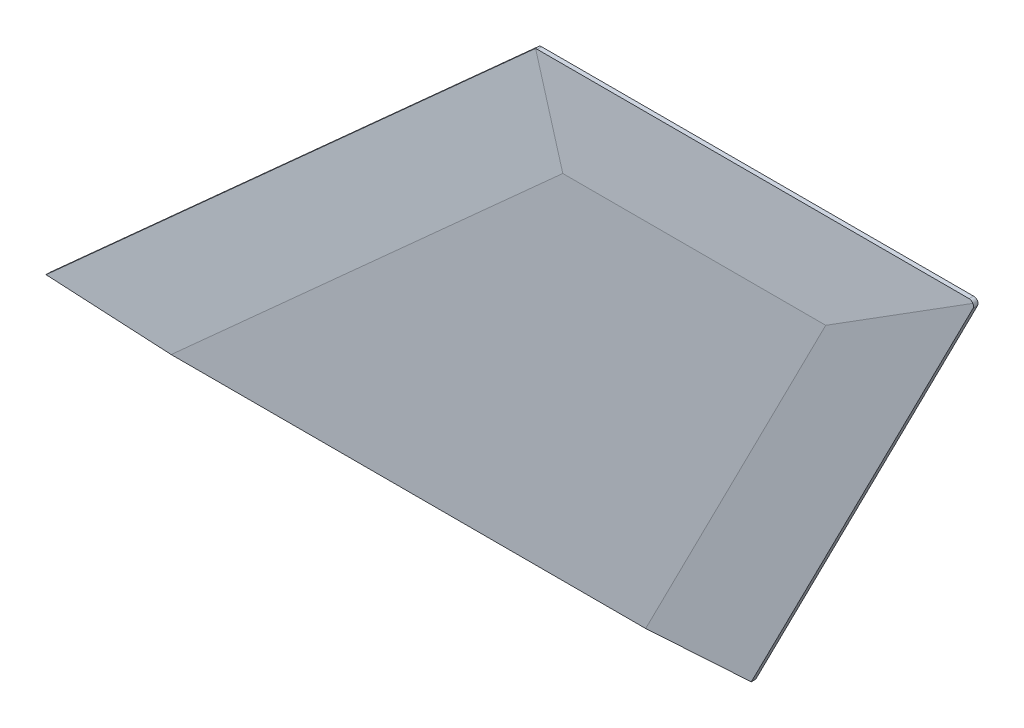
ISO-10303-21;
HEADER;
FILE_DESCRIPTION(('STEP AP214'),'2;1');
FILE_NAME('part.step','',(''),(''),'','','');
FILE_SCHEMA(('AUTOMOTIVE_DESIGN { 1 0 10303 214 1 1 1 1 }'));
ENDSEC;
DATA;
#1=APPLICATION_CONTEXT('core data for automotive mechanical design processes');
#2=APPLICATION_PROTOCOL_DEFINITION('international standard','automotive_design',2000,#1);
#3=PRODUCT_CONTEXT('',#1,'mechanical');
#4=PRODUCT('Part','Part','',(#3));
#5=PRODUCT_RELATED_PRODUCT_CATEGORY('part','',(#4));
#6=PRODUCT_DEFINITION_FORMATION('','',#4);
#7=PRODUCT_DEFINITION_CONTEXT('part definition',#1,'design');
#8=PRODUCT_DEFINITION('design','',#6,#7);
#9=PRODUCT_DEFINITION_SHAPE('','',#8);
#10=(LENGTH_UNIT() NAMED_UNIT(*) SI_UNIT(.MILLI.,.METRE.));
#11=(NAMED_UNIT(*) PLANE_ANGLE_UNIT() SI_UNIT($,.RADIAN.));
#12=(NAMED_UNIT(*) SI_UNIT($,.STERADIAN.) SOLID_ANGLE_UNIT());
#13=UNCERTAINTY_MEASURE_WITH_UNIT(LENGTH_MEASURE(1.E-05),#10,'distance_accuracy_value','');
#14=(GEOMETRIC_REPRESENTATION_CONTEXT(3) GLOBAL_UNCERTAINTY_ASSIGNED_CONTEXT((#13)) GLOBAL_UNIT_ASSIGNED_CONTEXT((#10,
#11,#12)) REPRESENTATION_CONTEXT('',''));
#15=CARTESIAN_POINT('',(0.,0.,0.));
#16=DIRECTION('',(0.,0.,1.));
#17=DIRECTION('',(1.,0.,0.));
#18=AXIS2_PLACEMENT_3D('',#15,#16,#17);
#19=CARTESIAN_POINT('',(55.5306257414602,50.,1.));
#20=DIRECTION('',(0.669130606358854,-0.743144825477398,0.));
#21=DIRECTION('',(0.743144825477398,0.669130606358854,0.));
#22=AXIS2_PLACEMENT_3D('',#19,#20,#21);
#23=PLANE('',#22);
#24=DIRECTION('',(0.743144825477398,0.669130606358854,0.));
#25=VECTOR('',#24,1.);
#26=CARTESIAN_POINT('',(55.5306257414602,50.,0.249999999999999));
#27=LINE('',#26,#25);
#28=CARTESIAN_POINT('',(0.,0.,0.249999999999999));
#29=VERTEX_POINT('',#28);
#30=CARTESIAN_POINT('',(55.3879924557985,49.8715724127387,0.249999999999999));
#31=VERTEX_POINT('',#30);
#32=EDGE_CURVE('E184',#29,#31,#27,.T.);
#33=ORIENTED_EDGE('',*,*,#32,.T.);
#34=DIRECTION('',(0.,0.,-1.));
#35=VECTOR('',#34,1.);
#36=CARTESIAN_POINT('',(55.3879924557985,49.8715724127387,1.));
#37=LINE('',#36,#35);
#38=CARTESIAN_POINT('',(55.3879924557985,49.8715724127387,-0.249999999999999));
#39=VERTEX_POINT('',#38);
#40=EDGE_CURVE('E153',#31,#39,#37,.T.);
#41=ORIENTED_EDGE('',*,*,#40,.T.);
#42=DIRECTION('',(0.743144825477398,0.669130606358854,0.));
#43=VECTOR('',#42,1.);
#44=CARTESIAN_POINT('',(55.5306257414602,50.,-0.249999999999999));
#45=LINE('',#44,#43);
#46=CARTESIAN_POINT('',(0.,0.,-0.249999999999999));
#47=VERTEX_POINT('',#46);
#48=EDGE_CURVE('E139',#47,#39,#45,.T.);
#49=ORIENTED_EDGE('',*,*,#48,.F.);
#50=DIRECTION('',(0.,0.,-1.));
#51=VECTOR('',#50,1.);
#52=CARTESIAN_POINT('',(0.,0.,1.));
#53=LINE('',#52,#51);
#54=EDGE_CURVE('E152',#29,#47,#53,.T.);
#55=ORIENTED_EDGE('',*,*,#54,.F.);
#56=EDGE_LOOP('',(#33,#41,#49,#55));
#57=FACE_BOUND('',#56,.T.);
#58=ADVANCED_FACE('F46',(#57),#23,.F.);
#59=CARTESIAN_POINT('',(0.,0.,1.));
#60=DIRECTION('',(0.,1.,0.));
#61=DIRECTION('',(0.,0.,1.));
#62=AXIS2_PLACEMENT_3D('',#59,#60,#61);
#63=PLANE('',#62);
#64=DIRECTION('',(-0.997776578470076,0.,-0.066647576524195));
#65=VECTOR('',#64,1.);
#66=CARTESIAN_POINT('',(54.61257312416,0.,-1.94578091124806));
#67=LINE('',#66,#65);
#68=CARTESIAN_POINT('',(80.,0.,-0.249999999999999));
#69=VERTEX_POINT('',#68);
#70=CARTESIAN_POINT('',(68.7717982726515,0.,-1.));
#71=VERTEX_POINT('',#70);
#72=EDGE_CURVE('E266',#69,#71,#67,.T.);
#73=ORIENTED_EDGE('',*,*,#72,.F.);
#74=DIRECTION('',(0.,0.,-1.));
#75=VECTOR('',#74,1.);
#76=CARTESIAN_POINT('',(80.,0.,1.));
#77=LINE('',#76,#75);
#78=CARTESIAN_POINT('',(80.,0.,0.249999999999999));
#79=VERTEX_POINT('',#78);
#80=EDGE_CURVE('E162',#79,#69,#77,.T.);
#81=ORIENTED_EDGE('',*,*,#80,.F.);
#82=DIRECTION('',(-0.997776578470076,0.,0.066647576524195));
#83=VECTOR('',#82,1.);
#84=CARTESIAN_POINT('',(54.61257312416,0.,1.94578091124806));
#85=LINE('',#84,#83);
#86=CARTESIAN_POINT('',(68.7717982726515,0.,1.));
#87=VERTEX_POINT('',#86);
#88=EDGE_CURVE('E179',#79,#87,#85,.T.);
#89=ORIENTED_EDGE('',*,*,#88,.T.);
#90=DIRECTION('',(1.,0.,0.));
#91=VECTOR('',#90,1.);
#92=CARTESIAN_POINT('',(0.,0.,1.));
#93=LINE('',#92,#91);
#94=CARTESIAN_POINT('',(14.9447654986468,0.,1.));
#95=VERTEX_POINT('',#94);
#96=EDGE_CURVE('E169',#95,#87,#93,.T.);
#97=ORIENTED_EDGE('',*,*,#96,.F.);
#98=DIRECTION('',(-0.998743116762066,0.,-0.0501217190486778));
#99=VECTOR('',#98,1.);
#100=CARTESIAN_POINT('',(6.71204029477891,0.,0.58684236942627));
#101=LINE('',#100,#99);
#102=EDGE_CURVE('E159',#95,#29,#101,.T.);
#103=ORIENTED_EDGE('',*,*,#102,.T.);
#104=ORIENTED_EDGE('',*,*,#54,.T.);
#105=DIRECTION('',(-0.998743116762066,0.,0.0501217190486778));
#106=VECTOR('',#105,1.);
#107=CARTESIAN_POINT('',(6.71204029477891,0.,-0.58684236942627));
#108=LINE('',#107,#106);
#109=CARTESIAN_POINT('',(14.9447654986468,0.,-1.));
#110=VERTEX_POINT('',#109);
#111=EDGE_CURVE('E136',#110,#47,#108,.T.);
#112=ORIENTED_EDGE('',*,*,#111,.F.);
#113=DIRECTION('',(1.,0.,0.));
#114=VECTOR('',#113,1.);
#115=CARTESIAN_POINT('',(0.,0.,-1.));
#116=LINE('',#115,#114);
#117=EDGE_CURVE('E203',#110,#71,#116,.T.);
#118=ORIENTED_EDGE('',*,*,#117,.T.);
#119=EDGE_LOOP('',(#73,#81,#89,#97,#103,#104,#112,#118));
#120=FACE_BOUND('',#119,.T.);
#121=ADVANCED_FACE('F157',(#120),#63,.F.);
#122=CARTESIAN_POINT('',(80.,0.,1.));
#123=DIRECTION('',(-0.890614565255225,0.454758942908489,0.));
#124=DIRECTION('',(-0.454758942908489,-0.890614565255225,0.));
#125=AXIS2_PLACEMENT_3D('',#122,#123,#124);
#126=PLANE('',#125);
#127=DIRECTION('',(-0.454758942908489,-0.890614565255225,0.));
#128=VECTOR('',#127,1.);
#129=CARTESIAN_POINT('',(80.,0.,-0.249999999999999));
#130=LINE('',#129,#128);
#131=CARTESIAN_POINT('',(105.159216680306,49.2726205285458,-0.249999999999999));
#132=VERTEX_POINT('',#131);
#133=EDGE_CURVE('E273',#132,#69,#130,.T.);
#134=ORIENTED_EDGE('',*,*,#133,.F.);
#135=DIRECTION('',(0.,0.,-1.));
#136=VECTOR('',#135,1.);
#137=CARTESIAN_POINT('',(105.159216680306,49.2726205285458,1.));
#138=LINE('',#137,#136);
#139=CARTESIAN_POINT('',(105.159216680306,49.2726205285458,0.249999999999999));
#140=VERTEX_POINT('',#139);
#141=EDGE_CURVE('E219',#132,#140,#138,.F.);
#142=ORIENTED_EDGE('',*,*,#141,.T.);
#143=DIRECTION('',(-0.454758942908489,-0.890614565255225,0.));
#144=VECTOR('',#143,1.);
#145=CARTESIAN_POINT('',(80.,0.,0.249999999999999));
#146=LINE('',#145,#144);
#147=EDGE_CURVE('E191',#140,#79,#146,.T.);
#148=ORIENTED_EDGE('',*,*,#147,.T.);
#149=ORIENTED_EDGE('',*,*,#80,.T.);
#150=EDGE_LOOP('',(#134,#142,#148,#149));
#151=FACE_BOUND('',#150,.T.);
#152=ADVANCED_FACE('F290',(#151),#126,.F.);
#153=CARTESIAN_POINT('',(105.53062574146,50.,1.));
#154=DIRECTION('',(0.,-1.,0.));
#155=DIRECTION('',(1.,0.,0.));
#156=AXIS2_PLACEMENT_3D('',#153,#154,#155);
#157=PLANE('',#156);
#158=DIRECTION('',(1.,0.,0.));
#159=VECTOR('',#158,1.);
#160=CARTESIAN_POINT('',(105.53062574146,50.,0.249999999999999));
#161=LINE('',#160,#159);
#162=CARTESIAN_POINT('',(55.7225577589779,50.,0.249999999999999));
#163=VERTEX_POINT('',#162);
#164=CARTESIAN_POINT('',(104.713909397678,50.,0.249999999999999));
#165=VERTEX_POINT('',#164);
#166=EDGE_CURVE('E187',#163,#165,#161,.T.);
#167=ORIENTED_EDGE('',*,*,#166,.T.);
#168=DIRECTION('',(0.,0.,-1.));
#169=VECTOR('',#168,1.);
#170=CARTESIAN_POINT('',(104.713909397678,50.,1.));
#171=LINE('',#170,#169);
#172=CARTESIAN_POINT('',(104.713909397678,50.,-0.249999999999999));
#173=VERTEX_POINT('',#172);
#174=EDGE_CURVE('E206',#165,#173,#171,.T.);
#175=ORIENTED_EDGE('',*,*,#174,.T.);
#176=DIRECTION('',(1.,0.,0.));
#177=VECTOR('',#176,1.);
#178=CARTESIAN_POINT('',(105.53062574146,50.,-0.249999999999999));
#179=LINE('',#178,#177);
#180=CARTESIAN_POINT('',(55.7225577589779,50.,-0.249999999999999));
#181=VERTEX_POINT('',#180);
#182=EDGE_CURVE('E248',#181,#173,#179,.T.);
#183=ORIENTED_EDGE('',*,*,#182,.F.);
#184=DIRECTION('',(0.,0.,-1.));
#185=VECTOR('',#184,1.);
#186=CARTESIAN_POINT('',(55.7225577589779,50.,1.));
#187=LINE('',#186,#185);
#188=EDGE_CURVE('E194',#181,#163,#187,.F.);
#189=ORIENTED_EDGE('',*,*,#188,.T.);
#190=EDGE_LOOP('',(#167,#175,#183,#189));
#191=FACE_BOUND('',#190,.T.);
#192=ADVANCED_FACE('F246',(#191),#157,.F.);
#193=CARTESIAN_POINT('',(0.,0.,-1.));
#194=DIRECTION('',(0.,0.,1.));
#195=DIRECTION('',(1.,0.,0.));
#196=AXIS2_PLACEMENT_3D('',#193,#194,#195);
#197=PLANE('',#196);
#198=DIRECTION('',(0.454758942908489,0.890614565255225,0.));
#199=VECTOR('',#198,1.);
#200=CARTESIAN_POINT('',(96.6244800889076,54.5475894290851,-1.));
#201=LINE('',#200,#199);
#202=CARTESIAN_POINT('',(89.1962988658195,39.9999999999995,-1.));
#203=VERTEX_POINT('',#202);
#204=EDGE_CURVE('E199',#71,#203,#201,.T.);
#205=ORIENTED_EDGE('',*,*,#204,.F.);
#206=ORIENTED_EDGE('',*,*,#117,.F.);
#207=DIRECTION('',(-0.743144825477398,-0.669130606358854,0.));
#208=VECTOR('',#207,1.);
#209=CARTESIAN_POINT('',(6.69130606358884,-7.43144825477431,-1.));
#210=LINE('',#209,#208);
#211=CARTESIAN_POINT('',(59.3692660918145,39.9999999999995,-1.));
#212=VERTEX_POINT('',#211);
#213=EDGE_CURVE('E142',#212,#110,#210,.T.);
#214=ORIENTED_EDGE('',*,*,#213,.F.);
#215=DIRECTION('',(-1.,0.,0.));
#216=VECTOR('',#215,1.);
#217=CARTESIAN_POINT('',(55.5306257414602,39.9999999999995,-1.));
#218=LINE('',#217,#216);
#219=EDGE_CURVE('E239',#203,#212,#218,.T.);
#220=ORIENTED_EDGE('',*,*,#219,.F.);
#221=EDGE_LOOP('',(#205,#206,#214,#220));
#222=FACE_BOUND('',#221,.T.);
#223=ADVANCED_FACE('F285',(#222),#197,.F.);
#224=CARTESIAN_POINT('',(0.,0.,1.));
#225=DIRECTION('',(0.,0.,1.));
#226=DIRECTION('',(1.,0.,0.));
#227=AXIS2_PLACEMENT_3D('',#224,#225,#226);
#228=PLANE('',#227);
#229=DIRECTION('',(-1.,0.,0.));
#230=VECTOR('',#229,1.);
#231=CARTESIAN_POINT('',(55.5306257414602,39.9999999999995,1.));
#232=LINE('',#231,#230);
#233=CARTESIAN_POINT('',(89.1962988658195,39.9999999999995,1.));
#234=VERTEX_POINT('',#233);
#235=CARTESIAN_POINT('',(59.3692660918145,39.9999999999995,1.));
#236=VERTEX_POINT('',#235);
#237=EDGE_CURVE('E166',#234,#236,#232,.T.);
#238=ORIENTED_EDGE('',*,*,#237,.T.);
#239=DIRECTION('',(-0.743144825477398,-0.669130606358854,0.));
#240=VECTOR('',#239,1.);
#241=CARTESIAN_POINT('',(6.69130606358884,-7.43144825477431,1.));
#242=LINE('',#241,#240);
#243=EDGE_CURVE('E175',#236,#95,#242,.T.);
#244=ORIENTED_EDGE('',*,*,#243,.T.);
#245=ORIENTED_EDGE('',*,*,#96,.T.);
#246=DIRECTION('',(0.454758942908489,0.890614565255225,0.));
#247=VECTOR('',#246,1.);
#248=CARTESIAN_POINT('',(96.6244800889076,54.5475894290851,1.));
#249=LINE('',#248,#247);
#250=EDGE_CURVE('E161',#87,#234,#249,.T.);
#251=ORIENTED_EDGE('',*,*,#250,.T.);
#252=EDGE_LOOP('',(#238,#244,#245,#251));
#253=FACE_BOUND('',#252,.T.);
#254=ADVANCED_FACE('F297',(#253),#228,.T.);
#255=CARTESIAN_POINT('',(54.5493986550276,-27.8536056296645,1.));
#256=DIRECTION('',(0.0666090172386809,-0.0340113978025447,0.997199309888457));
#257=DIRECTION('',(-0.454758942908489,-0.890614565255225,0.));
#258=AXIS2_PLACEMENT_3D('',#255,#256,#257);
#259=PLANE('',#258);
#260=ORIENTED_EDGE('',*,*,#147,.F.);
#261=CARTESIAN_POINT('',(104.713909397678,49.5,0.287499999999997));
#262=DIRECTION('',(0.0666090172386809,-0.0340113978025447,0.997199309888457));
#263=DIRECTION('',(0.888120229849118,-0.45348530403395,-0.0747899482416309));
#264=AXIS2_PLACEMENT_3D('',#261,#262,#263);
#265=ELLIPSE('',#264,0.501404278003289,0.5);
#266=CARTESIAN_POINT('',(105.140342121403,49.761065379046,0.267920096571548));
#267=VERTEX_POINT('',#266);
#268=EDGE_CURVE('E222',#140,#267,#265,.T.);
#269=ORIENTED_EDGE('',*,*,#268,.T.);
#270=DIRECTION('',(-0.852212268068196,-0.521730876672445,0.0391298157504316));
#271=VECTOR('',#270,1.);
#272=CARTESIAN_POINT('',(33.8640017140697,6.12514395419038,3.54061420343557));
#273=LINE('',#272,#271);
#274=EDGE_CURVE('E198',#234,#267,#273,.F.);
#275=ORIENTED_EDGE('',*,*,#274,.F.);
#276=ORIENTED_EDGE('',*,*,#250,.F.);
#277=ORIENTED_EDGE('',*,*,#88,.F.);
#278=EDGE_LOOP('',(#260,#269,#275,#276,#277));
#279=FACE_BOUND('',#278,.T.);
#280=ADVANCED_FACE('F295',(#279),#259,.T.);
#281=CARTESIAN_POINT('',(0.,39.9999999999995,1.));
#282=DIRECTION('',(0.,0.0747899482416309,0.997199309888457));
#283=DIRECTION('',(1.,0.,0.));
#284=AXIS2_PLACEMENT_3D('',#281,#282,#283);
#285=PLANE('',#284);
#286=ORIENTED_EDGE('',*,*,#274,.T.);
#287=CARTESIAN_POINT('',(104.713909397678,49.5,0.287499999999998));
#288=DIRECTION('',(0.,0.0747899482416309,0.997199309888457));
#289=DIRECTION('',(0.,0.997199309888457,-0.0747899482416309));
#290=AXIS2_PLACEMENT_3D('',#287,#288,#289);
#291=ELLIPSE('',#290,0.501404278003289,0.5);
#292=EDGE_CURVE('E228',#267,#165,#291,.T.);
#293=ORIENTED_EDGE('',*,*,#292,.T.);
#294=ORIENTED_EDGE('',*,*,#166,.F.);
#295=CARTESIAN_POINT('',(55.7225577589779,49.5,0.287499999999998));
#296=DIRECTION('',(0.,0.0747899482416309,0.997199309888457));
#297=DIRECTION('',(0.,0.997199309888457,-0.0747899482416309));
#298=AXIS2_PLACEMENT_3D('',#295,#296,#297);
#299=ELLIPSE('',#298,0.501404278003289,0.5);
#300=CARTESIAN_POINT('',(55.5433737842053,49.9667902132486,0.252490734006354));
#301=VERTEX_POINT('',#300);
#302=EDGE_CURVE('E225',#163,#301,#299,.T.);
#303=ORIENTED_EDGE('',*,*,#302,.T.);
#304=DIRECTION('',(0.357492700052079,-0.93130032361354,0.0698475242710124));
#305=VECTOR('',#304,1.);
#306=CARTESIAN_POINT('',(51.7818126998775,59.7659918602088,-0.482449389515631));
#307=LINE('',#306,#305);
#308=EDGE_CURVE('E195',#236,#301,#307,.F.);
#309=ORIENTED_EDGE('',*,*,#308,.F.);
#310=ORIENTED_EDGE('',*,*,#237,.F.);
#311=EDGE_LOOP('',(#286,#293,#294,#303,#309,#310));
#312=FACE_BOUND('',#311,.T.);
#313=ADVANCED_FACE('F250',(#312),#285,.T.);
#314=CARTESIAN_POINT('',(6.69130606358884,-7.43144825477431,1.));
#315=DIRECTION('',(-0.0500442434164698,0.0555797630334905,0.997199309888457));
#316=DIRECTION('',(0.743144825477398,0.669130606358854,0.));
#317=AXIS2_PLACEMENT_3D('',#314,#315,#316);
#318=PLANE('',#317);
#319=ORIENTED_EDGE('',*,*,#308,.T.);
#320=CARTESIAN_POINT('',(55.7225577589779,49.5,0.287499999999998));
#321=DIRECTION('',(-0.0500442434164698,0.0555797630334905,0.997199309888457));
#322=DIRECTION('',(-0.667256578886294,0.741063507113239,-0.0747899482416309));
#323=AXIS2_PLACEMENT_3D('',#320,#321,#322);
#324=ELLIPSE('',#323,0.501404278003289,0.5);
#325=EDGE_CURVE('E11',#301,#31,#324,.T.);
#326=ORIENTED_EDGE('',*,*,#325,.T.);
#327=ORIENTED_EDGE('',*,*,#32,.F.);
#328=ORIENTED_EDGE('',*,*,#102,.F.);
#329=ORIENTED_EDGE('',*,*,#243,.F.);
#330=EDGE_LOOP('',(#319,#326,#327,#328,#329));
#331=FACE_BOUND('',#330,.T.);
#332=ADVANCED_FACE('F299',(#331),#318,.T.);
#333=CARTESIAN_POINT('',(54.5493986550276,-27.8536056296645,-1.));
#334=DIRECTION('',(0.0666090172386809,-0.0340113978025447,-0.997199309888457));
#335=DIRECTION('',(-0.454758942908489,-0.890614565255225,0.));
#336=AXIS2_PLACEMENT_3D('',#333,#334,#335);
#337=PLANE('',#336);
#338=DIRECTION('',(-0.852212268068196,-0.521730876672445,-0.0391298157504316));
#339=VECTOR('',#338,1.);
#340=CARTESIAN_POINT('',(33.8640017140697,6.12514395419038,-3.54061420343557));
#341=LINE('',#340,#339);
#342=CARTESIAN_POINT('',(105.140342121403,49.761065379046,-0.267920096571548));
#343=VERTEX_POINT('',#342);
#344=EDGE_CURVE('E262',#203,#343,#341,.F.);
#345=ORIENTED_EDGE('',*,*,#344,.T.);
#346=CARTESIAN_POINT('',(104.713909397678,49.5,-0.287499999999998));
#347=DIRECTION('',(0.0666090172386809,-0.0340113978025447,-0.997199309888457));
#348=DIRECTION('',(-0.888120229849118,0.45348530403395,-0.0747899482416309));
#349=AXIS2_PLACEMENT_3D('',#346,#347,#348);
#350=ELLIPSE('',#349,0.501404278003289,0.5);
#351=EDGE_CURVE('E216',#343,#132,#350,.T.);
#352=ORIENTED_EDGE('',*,*,#351,.T.);
#353=ORIENTED_EDGE('',*,*,#133,.T.);
#354=ORIENTED_EDGE('',*,*,#72,.T.);
#355=ORIENTED_EDGE('',*,*,#204,.T.);
#356=EDGE_LOOP('',(#345,#352,#353,#354,#355));
#357=FACE_BOUND('',#356,.T.);
#358=ADVANCED_FACE('F287',(#357),#337,.T.);
#359=CARTESIAN_POINT('',(0.,39.9999999999995,-1.));
#360=DIRECTION('',(0.,0.0747899482416309,-0.997199309888457));
#361=DIRECTION('',(1.,0.,0.));
#362=AXIS2_PLACEMENT_3D('',#359,#360,#361);
#363=PLANE('',#362);
#364=ORIENTED_EDGE('',*,*,#182,.T.);
#365=CARTESIAN_POINT('',(104.713909397678,49.5,-0.287499999999998));
#366=DIRECTION('',(0.,0.0747899482416309,-0.997199309888457));
#367=DIRECTION('',(0.,-0.997199309888457,-0.0747899482416309));
#368=AXIS2_PLACEMENT_3D('',#365,#366,#367);
#369=ELLIPSE('',#368,0.501404278003289,0.5);
#370=EDGE_CURVE('E213',#173,#343,#369,.T.);
#371=ORIENTED_EDGE('',*,*,#370,.T.);
#372=ORIENTED_EDGE('',*,*,#344,.F.);
#373=ORIENTED_EDGE('',*,*,#219,.T.);
#374=DIRECTION('',(0.357492700052079,-0.93130032361354,-0.0698475242710124));
#375=VECTOR('',#374,1.);
#376=CARTESIAN_POINT('',(51.7818126998775,59.7659918602088,0.482449389515631));
#377=LINE('',#376,#375);
#378=CARTESIAN_POINT('',(55.5433737842053,49.9667902132486,-0.252490734006354));
#379=VERTEX_POINT('',#378);
#380=EDGE_CURVE('E148',#212,#379,#377,.F.);
#381=ORIENTED_EDGE('',*,*,#380,.T.);
#382=CARTESIAN_POINT('',(55.7225577589779,49.5,-0.287499999999998));
#383=DIRECTION('',(0.,0.0747899482416309,-0.997199309888457));
#384=DIRECTION('',(0.,-0.997199309888457,-0.0747899482416309));
#385=AXIS2_PLACEMENT_3D('',#382,#383,#384);
#386=ELLIPSE('',#385,0.501404278003289,0.5);
#387=EDGE_CURVE('E210',#379,#181,#386,.T.);
#388=ORIENTED_EDGE('',*,*,#387,.T.);
#389=EDGE_LOOP('',(#364,#371,#372,#373,#381,#388));
#390=FACE_BOUND('',#389,.T.);
#391=ADVANCED_FACE('F236',(#390),#363,.T.);
#392=CARTESIAN_POINT('',(6.69130606358884,-7.43144825477431,-1.));
#393=DIRECTION('',(-0.0500442434164698,0.0555797630334905,-0.997199309888457));
#394=DIRECTION('',(0.743144825477398,0.669130606358854,0.));
#395=AXIS2_PLACEMENT_3D('',#392,#393,#394);
#396=PLANE('',#395);
#397=ORIENTED_EDGE('',*,*,#48,.T.);
#398=CARTESIAN_POINT('',(55.7225577589779,49.5,-0.287499999999997));
#399=DIRECTION('',(-0.0500442434164698,0.0555797630334905,-0.997199309888457));
#400=DIRECTION('',(0.667256578886294,-0.741063507113239,-0.0747899482416309));
#401=AXIS2_PLACEMENT_3D('',#398,#399,#400);
#402=ELLIPSE('',#401,0.501404278003289,0.5);
#403=EDGE_CURVE('E55',#39,#379,#402,.T.);
#404=ORIENTED_EDGE('',*,*,#403,.T.);
#405=ORIENTED_EDGE('',*,*,#380,.F.);
#406=ORIENTED_EDGE('',*,*,#213,.T.);
#407=ORIENTED_EDGE('',*,*,#111,.T.);
#408=EDGE_LOOP('',(#397,#404,#405,#406,#407));
#409=FACE_BOUND('',#408,.T.);
#410=ADVANCED_FACE('F138',(#409),#396,.T.);
#411=CARTESIAN_POINT('',(104.713909397678,49.5,1.));
#412=DIRECTION('',(0.,0.,-1.));
#413=DIRECTION('',(-1.,0.,0.));
#414=AXIS2_PLACEMENT_3D('',#411,#412,#413);
#415=CYLINDRICAL_SURFACE('',#414,0.5);
#416=ORIENTED_EDGE('',*,*,#268,.F.);
#417=ORIENTED_EDGE('',*,*,#141,.F.);
#418=ORIENTED_EDGE('',*,*,#351,.F.);
#419=ORIENTED_EDGE('',*,*,#370,.F.);
#420=ORIENTED_EDGE('',*,*,#174,.F.);
#421=ORIENTED_EDGE('',*,*,#292,.F.);
#422=EDGE_LOOP('',(#416,#417,#418,#419,#420,#421));
#423=FACE_BOUND('',#422,.T.);
#424=ADVANCED_FACE('F257',(#423),#415,.T.);
#425=CARTESIAN_POINT('',(55.7225577589779,49.5,1.));
#426=DIRECTION('',(0.,0.,-1.));
#427=DIRECTION('',(-1.,0.,0.));
#428=AXIS2_PLACEMENT_3D('',#425,#426,#427);
#429=CYLINDRICAL_SURFACE('',#428,0.5);
#430=ORIENTED_EDGE('',*,*,#302,.F.);
#431=ORIENTED_EDGE('',*,*,#188,.F.);
#432=ORIENTED_EDGE('',*,*,#387,.F.);
#433=ORIENTED_EDGE('',*,*,#403,.F.);
#434=ORIENTED_EDGE('',*,*,#40,.F.);
#435=ORIENTED_EDGE('',*,*,#325,.F.);
#436=EDGE_LOOP('',(#430,#431,#432,#433,#434,#435));
#437=FACE_BOUND('',#436,.T.);
#438=ADVANCED_FACE('F48',(#437),#429,.T.);
#439=CLOSED_SHELL('',(#58,#121,#152,#192,#223,#254,#280,#313,#332,#358,#391,#410,#424,#438));
#440=MANIFOLD_SOLID_BREP('B2',#439);
#441=ADVANCED_BREP_SHAPE_REPRESENTATION('',(#18,#440),#14);
#442=SHAPE_DEFINITION_REPRESENTATION(#9,#441);
ENDSEC;
END-ISO-10303-21;
